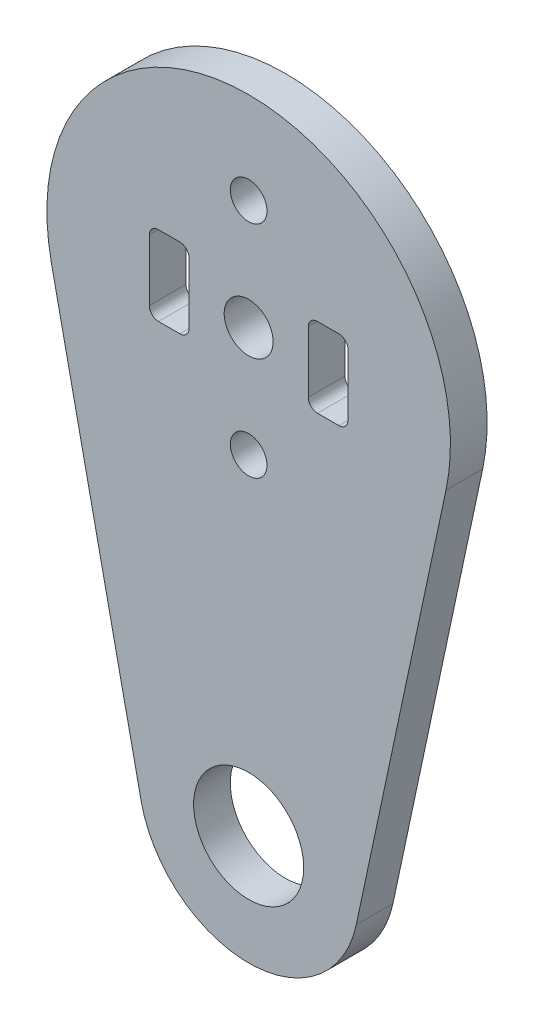
ISO-10303-21;
HEADER;
FILE_DESCRIPTION(('STEP AP214'),'2;1');
FILE_NAME('part.step','',(''),(''),'','','');
FILE_SCHEMA(('AUTOMOTIVE_DESIGN { 1 0 10303 214 1 1 1 1 }'));
ENDSEC;
DATA;
#1=APPLICATION_CONTEXT('core data for automotive mechanical design processes');
#2=APPLICATION_PROTOCOL_DEFINITION('international standard','automotive_design',2000,#1);
#3=PRODUCT_CONTEXT('',#1,'mechanical');
#4=PRODUCT('Part','Part','',(#3));
#5=PRODUCT_RELATED_PRODUCT_CATEGORY('part','',(#4));
#6=PRODUCT_DEFINITION_FORMATION('','',#4);
#7=PRODUCT_DEFINITION_CONTEXT('part definition',#1,'design');
#8=PRODUCT_DEFINITION('design','',#6,#7);
#9=PRODUCT_DEFINITION_SHAPE('','',#8);
#10=(LENGTH_UNIT() NAMED_UNIT(*) SI_UNIT(.MILLI.,.METRE.));
#11=(NAMED_UNIT(*) PLANE_ANGLE_UNIT() SI_UNIT($,.RADIAN.));
#12=(NAMED_UNIT(*) SI_UNIT($,.STERADIAN.) SOLID_ANGLE_UNIT());
#13=UNCERTAINTY_MEASURE_WITH_UNIT(LENGTH_MEASURE(1.E-05),#10,'distance_accuracy_value','');
#14=(GEOMETRIC_REPRESENTATION_CONTEXT(3) GLOBAL_UNCERTAINTY_ASSIGNED_CONTEXT((#13)) GLOBAL_UNIT_ASSIGNED_CONTEXT((#10,
#11,#12)) REPRESENTATION_CONTEXT('',''));
#15=CARTESIAN_POINT('',(0.,0.,0.));
#16=DIRECTION('',(0.,0.,1.));
#17=DIRECTION('',(1.,0.,0.));
#18=AXIS2_PLACEMENT_3D('',#15,#16,#17);
#19=CARTESIAN_POINT('',(215.7478079135,205.9520199932,3.));
#20=DIRECTION('',(0.,0.,1.));
#21=DIRECTION('',(1.,0.,0.));
#22=AXIS2_PLACEMENT_3D('',#19,#20,#21);
#23=PLANE('',#22);
#24=DIRECTION('',(-1.,0.,0.));
#25=VECTOR('',#24,1.);
#26=CARTESIAN_POINT('',(208.3728079135,245.2020199932,3.));
#27=LINE('',#26,#25);
#28=CARTESIAN_POINT('',(210.1228079135,245.2020199932,3.));
#29=VERTEX_POINT('',#28);
#30=CARTESIAN_POINT('',(208.3728079135,245.2020199932,3.));
#31=VERTEX_POINT('',#30);
#32=EDGE_CURVE('E178',#29,#31,#27,.T.);
#33=ORIENTED_EDGE('',*,*,#32,.F.);
#34=CARTESIAN_POINT('',(210.1228079135,244.4520199932,3.));
#35=DIRECTION('',(0.,0.,1.));
#36=DIRECTION('',(1.,0.,0.));
#37=AXIS2_PLACEMENT_3D('',#34,#35,#36);
#38=CIRCLE('',#37,0.750000000000001);
#39=CARTESIAN_POINT('',(210.8728079135,244.4520199932,3.));
#40=VERTEX_POINT('',#39);
#41=EDGE_CURVE('E170',#40,#29,#38,.T.);
#42=ORIENTED_EDGE('',*,*,#41,.F.);
#43=DIRECTION('',(0.,1.,0.));
#44=VECTOR('',#43,1.);
#45=CARTESIAN_POINT('',(210.8728079135,244.4520199932,3.));
#46=LINE('',#45,#44);
#47=CARTESIAN_POINT('',(210.8728079135,239.4520199932,3.));
#48=VERTEX_POINT('',#47);
#49=EDGE_CURVE('E205',#48,#40,#46,.T.);
#50=ORIENTED_EDGE('',*,*,#49,.F.);
#51=CARTESIAN_POINT('',(210.1228079135,239.4520199932,3.));
#52=DIRECTION('',(0.,0.,1.));
#53=DIRECTION('',(1.,0.,0.));
#54=AXIS2_PLACEMENT_3D('',#51,#52,#53);
#55=CIRCLE('',#54,0.750000000000001);
#56=CARTESIAN_POINT('',(210.1228079135,238.7020199932,3.));
#57=VERTEX_POINT('',#56);
#58=EDGE_CURVE('E203',#57,#48,#55,.T.);
#59=ORIENTED_EDGE('',*,*,#58,.F.);
#60=DIRECTION('',(1.,0.,0.));
#61=VECTOR('',#60,1.);
#62=CARTESIAN_POINT('',(210.1228079135,238.7020199932,3.));
#63=LINE('',#62,#61);
#64=CARTESIAN_POINT('',(208.3728079135,238.7020199932,3.));
#65=VERTEX_POINT('',#64);
#66=EDGE_CURVE('E201',#65,#57,#63,.T.);
#67=ORIENTED_EDGE('',*,*,#66,.F.);
#68=CARTESIAN_POINT('',(208.3728079135,239.4520199932,3.));
#69=DIRECTION('',(0.,0.,1.));
#70=DIRECTION('',(1.,0.,0.));
#71=AXIS2_PLACEMENT_3D('',#68,#69,#70);
#72=CIRCLE('',#71,0.750000000000237);
#73=CARTESIAN_POINT('',(207.6228079135,239.4520199932,3.));
#74=VERTEX_POINT('',#73);
#75=EDGE_CURVE('E199',#74,#65,#72,.T.);
#76=ORIENTED_EDGE('',*,*,#75,.F.);
#77=DIRECTION('',(0.,-1.,0.));
#78=VECTOR('',#77,1.);
#79=CARTESIAN_POINT('',(207.6228079135,239.4520199932,3.));
#80=LINE('',#79,#78);
#81=CARTESIAN_POINT('',(207.6228079135,244.4520199932,3.));
#82=VERTEX_POINT('',#81);
#83=EDGE_CURVE('E194',#82,#74,#80,.T.);
#84=ORIENTED_EDGE('',*,*,#83,.F.);
#85=CARTESIAN_POINT('',(208.3728079135,244.4520199932,3.));
#86=DIRECTION('',(0.,0.,1.));
#87=DIRECTION('',(1.,0.,0.));
#88=AXIS2_PLACEMENT_3D('',#85,#86,#87);
#89=CIRCLE('',#88,0.750000000000001);
#90=EDGE_CURVE('E192',#31,#82,#89,.T.);
#91=ORIENTED_EDGE('',*,*,#90,.F.);
#92=EDGE_LOOP('',(#33,#42,#50,#59,#67,#76,#84,#91));
#93=FACE_BOUND('',#92,.T.);
#94=CARTESIAN_POINT('',(215.7478079135,250.9520199932,3.));
#95=DIRECTION('',(0.,0.,1.));
#96=DIRECTION('',(1.,0.,0.));
#97=AXIS2_PLACEMENT_3D('',#94,#95,#96);
#98=CIRCLE('',#97,1.5);
#99=CARTESIAN_POINT('',(217.2478079135,250.9520199932,3.));
#100=VERTEX_POINT('',#99);
#101=EDGE_CURVE('E297',#100,#100,#98,.T.);
#102=ORIENTED_EDGE('',*,*,#101,.F.);
#103=EDGE_LOOP('',(#102));
#104=FACE_BOUND('',#103,.T.);
#105=CARTESIAN_POINT('',(215.7478079135,241.9520199932,3.));
#106=DIRECTION('',(0.,0.,1.));
#107=DIRECTION('',(1.,0.,0.));
#108=AXIS2_PLACEMENT_3D('',#105,#106,#107);
#109=CIRCLE('',#108,2.);
#110=CARTESIAN_POINT('',(217.7478079135,241.9520199932,3.));
#111=VERTEX_POINT('',#110);
#112=EDGE_CURVE('E309',#111,#111,#109,.T.);
#113=ORIENTED_EDGE('',*,*,#112,.F.);
#114=EDGE_LOOP('',(#113));
#115=FACE_BOUND('',#114,.T.);
#116=CARTESIAN_POINT('',(215.7478079135,205.9520199932,3.));
#117=DIRECTION('',(0.,0.,1.));
#118=DIRECTION('',(1.,0.,0.));
#119=AXIS2_PLACEMENT_3D('',#116,#117,#118);
#120=CIRCLE('',#119,8.99999999997151);
#121=CARTESIAN_POINT('',(206.9452869678,204.0770199932,3.));
#122=VERTEX_POINT('',#121);
#123=CARTESIAN_POINT('',(224.5503288592,204.0770199932,3.));
#124=VERTEX_POINT('',#123);
#125=EDGE_CURVE('E315',#122,#124,#120,.T.);
#126=ORIENTED_EDGE('',*,*,#125,.T.);
#127=DIRECTION('',(0.208333333334938,0.97805788285845,0.));
#128=VECTOR('',#127,1.);
#129=CARTESIAN_POINT('',(231.8857629807,238.5145199932,3.));
#130=LINE('',#129,#128);
#131=CARTESIAN_POINT('',(231.8857629807,238.5145199932,3.));
#132=VERTEX_POINT('',#131);
#133=EDGE_CURVE('E318',#124,#132,#130,.T.);
#134=ORIENTED_EDGE('',*,*,#133,.T.);
#135=CARTESIAN_POINT('',(215.7478079135,241.9520199932,3.));
#136=DIRECTION('',(0.,0.,1.));
#137=DIRECTION('',(1.,0.,0.));
#138=AXIS2_PLACEMENT_3D('',#135,#136,#137);
#139=CIRCLE('',#138,16.5000000000293);
#140=CARTESIAN_POINT('',(199.6098528463,238.5145199932,3.));
#141=VERTEX_POINT('',#140);
#142=EDGE_CURVE('E321',#132,#141,#139,.T.);
#143=ORIENTED_EDGE('',*,*,#142,.T.);
#144=DIRECTION('',(0.208333333334939,-0.97805788285845,0.));
#145=VECTOR('',#144,1.);
#146=CARTESIAN_POINT('',(206.9452869678,204.0770199932,3.));
#147=LINE('',#146,#145);
#148=EDGE_CURVE('E323',#141,#122,#147,.T.);
#149=ORIENTED_EDGE('',*,*,#148,.T.);
#150=EDGE_LOOP('',(#126,#134,#143,#149));
#151=FACE_BOUND('',#150,.T.);
#152=CARTESIAN_POINT('',(215.7478079135,232.9520199932,3.));
#153=DIRECTION('',(0.,0.,1.));
#154=DIRECTION('',(1.,0.,0.));
#155=AXIS2_PLACEMENT_3D('',#152,#153,#154);
#156=CIRCLE('',#155,1.5);
#157=CARTESIAN_POINT('',(217.2478079135,232.9520199932,3.));
#158=VERTEX_POINT('',#157);
#159=EDGE_CURVE('E303',#158,#158,#156,.T.);
#160=ORIENTED_EDGE('',*,*,#159,.F.);
#161=EDGE_LOOP('',(#160));
#162=FACE_BOUND('',#161,.T.);
#163=DIRECTION('',(0.,-1.,0.));
#164=VECTOR('',#163,1.);
#165=CARTESIAN_POINT('',(220.6228079135,244.4520199932,3.));
#166=LINE('',#165,#164);
#167=CARTESIAN_POINT('',(220.6228079135,244.4520199932,3.));
#168=VERTEX_POINT('',#167);
#169=CARTESIAN_POINT('',(220.6228079135,239.4520199932,3.));
#170=VERTEX_POINT('',#169);
#171=EDGE_CURVE('E240',#168,#170,#166,.T.);
#172=ORIENTED_EDGE('',*,*,#171,.F.);
#173=CARTESIAN_POINT('',(221.3728079135,244.4520199932,3.));
#174=DIRECTION('',(0.,0.,1.));
#175=DIRECTION('',(1.,0.,0.));
#176=AXIS2_PLACEMENT_3D('',#173,#174,#175);
#177=CIRCLE('',#176,0.750000000000001);
#178=CARTESIAN_POINT('',(221.3728079135,245.2020199932,3.));
#179=VERTEX_POINT('',#178);
#180=EDGE_CURVE('E238',#179,#168,#177,.T.);
#181=ORIENTED_EDGE('',*,*,#180,.F.);
#182=DIRECTION('',(-1.,0.,0.));
#183=VECTOR('',#182,1.);
#184=CARTESIAN_POINT('',(223.1228079135,245.2020199932,3.));
#185=LINE('',#184,#183);
#186=CARTESIAN_POINT('',(223.1228079135,245.2020199932,3.));
#187=VERTEX_POINT('',#186);
#188=EDGE_CURVE('E254',#187,#179,#185,.T.);
#189=ORIENTED_EDGE('',*,*,#188,.F.);
#190=CARTESIAN_POINT('',(223.1228079135,244.4520199932,3.));
#191=DIRECTION('',(0.,0.,1.));
#192=DIRECTION('',(1.,0.,0.));
#193=AXIS2_PLACEMENT_3D('',#190,#191,#192);
#194=CIRCLE('',#193,0.750000000000001);
#195=CARTESIAN_POINT('',(223.8728079135,244.4520199932,3.));
#196=VERTEX_POINT('',#195);
#197=EDGE_CURVE('E251',#196,#187,#194,.T.);
#198=ORIENTED_EDGE('',*,*,#197,.F.);
#199=DIRECTION('',(0.,1.,0.));
#200=VECTOR('',#199,1.);
#201=CARTESIAN_POINT('',(223.8728079135,239.4520199932,3.));
#202=LINE('',#201,#200);
#203=CARTESIAN_POINT('',(223.8728079135,239.4520199932,3.));
#204=VERTEX_POINT('',#203);
#205=EDGE_CURVE('E249',#204,#196,#202,.T.);
#206=ORIENTED_EDGE('',*,*,#205,.F.);
#207=CARTESIAN_POINT('',(223.1228079135,239.4520199932,3.));
#208=DIRECTION('',(0.,0.,1.));
#209=DIRECTION('',(1.,0.,0.));
#210=AXIS2_PLACEMENT_3D('',#207,#208,#209);
#211=CIRCLE('',#210,0.750000000000001);
#212=CARTESIAN_POINT('',(223.1228079135,238.7020199932,3.));
#213=VERTEX_POINT('',#212);
#214=EDGE_CURVE('E247',#213,#204,#211,.T.);
#215=ORIENTED_EDGE('',*,*,#214,.F.);
#216=DIRECTION('',(1.,0.,0.));
#217=VECTOR('',#216,1.);
#218=CARTESIAN_POINT('',(221.3728079135,238.7020199932,3.));
#219=LINE('',#218,#217);
#220=CARTESIAN_POINT('',(221.3728079135,238.7020199932,3.));
#221=VERTEX_POINT('',#220);
#222=EDGE_CURVE('E245',#221,#213,#219,.T.);
#223=ORIENTED_EDGE('',*,*,#222,.F.);
#224=CARTESIAN_POINT('',(221.3728079135,239.4520199932,3.));
#225=DIRECTION('',(0.,0.,1.));
#226=DIRECTION('',(1.,0.,0.));
#227=AXIS2_PLACEMENT_3D('',#224,#225,#226);
#228=CIRCLE('',#227,0.750000000000001);
#229=EDGE_CURVE('E243',#170,#221,#228,.T.);
#230=ORIENTED_EDGE('',*,*,#229,.F.);
#231=EDGE_LOOP('',(#172,#181,#189,#198,#206,#215,#223,#230));
#232=FACE_BOUND('',#231,.T.);
#233=CARTESIAN_POINT('',(215.7478079135,205.9520199932,3.));
#234=DIRECTION('',(0.,0.,1.));
#235=DIRECTION('',(1.,0.,0.));
#236=AXIS2_PLACEMENT_3D('',#233,#234,#235);
#237=CIRCLE('',#236,4.5);
#238=CARTESIAN_POINT('',(220.2478079135,205.9520199932,3.));
#239=VERTEX_POINT('',#238);
#240=EDGE_CURVE('E208',#239,#239,#237,.T.);
#241=ORIENTED_EDGE('',*,*,#240,.F.);
#242=EDGE_LOOP('',(#241));
#243=FACE_BOUND('',#242,.T.);
#244=ADVANCED_FACE('F33',(#93,#104,#115,#151,#162,#232,#243),#23,.T.);
#245=CARTESIAN_POINT('',(215.7478079135,205.9520199932,0.));
#246=DIRECTION('',(0.,0.,1.));
#247=DIRECTION('',(1.,0.,0.));
#248=AXIS2_PLACEMENT_3D('',#245,#246,#247);
#249=PLANE('',#248);
#250=CARTESIAN_POINT('',(210.1228079135,244.4520199932,0.));
#251=DIRECTION('',(0.,0.,1.));
#252=DIRECTION('',(1.,0.,0.));
#253=AXIS2_PLACEMENT_3D('',#250,#251,#252);
#254=CIRCLE('',#253,0.750000000000001);
#255=CARTESIAN_POINT('',(210.8728079135,244.4520199932,0.));
#256=VERTEX_POINT('',#255);
#257=CARTESIAN_POINT('',(210.1228079135,245.2020199932,0.));
#258=VERTEX_POINT('',#257);
#259=EDGE_CURVE('E56',#256,#258,#254,.T.);
#260=ORIENTED_EDGE('',*,*,#259,.T.);
#261=DIRECTION('',(-1.,0.,0.));
#262=VECTOR('',#261,1.);
#263=CARTESIAN_POINT('',(208.3728079135,245.2020199932,0.));
#264=LINE('',#263,#262);
#265=CARTESIAN_POINT('',(208.3728079135,245.2020199932,0.));
#266=VERTEX_POINT('',#265);
#267=EDGE_CURVE('E185',#258,#266,#264,.T.);
#268=ORIENTED_EDGE('',*,*,#267,.T.);
#269=CARTESIAN_POINT('',(208.3728079135,244.4520199932,0.));
#270=DIRECTION('',(0.,0.,1.));
#271=DIRECTION('',(1.,0.,0.));
#272=AXIS2_PLACEMENT_3D('',#269,#270,#271);
#273=CIRCLE('',#272,0.750000000000001);
#274=CARTESIAN_POINT('',(207.6228079135,244.4520199932,0.));
#275=VERTEX_POINT('',#274);
#276=EDGE_CURVE('E210',#266,#275,#273,.T.);
#277=ORIENTED_EDGE('',*,*,#276,.T.);
#278=DIRECTION('',(0.,-1.,0.));
#279=VECTOR('',#278,1.);
#280=CARTESIAN_POINT('',(207.6228079135,239.4520199932,0.));
#281=LINE('',#280,#279);
#282=CARTESIAN_POINT('',(207.6228079135,239.4520199932,0.));
#283=VERTEX_POINT('',#282);
#284=EDGE_CURVE('E213',#275,#283,#281,.T.);
#285=ORIENTED_EDGE('',*,*,#284,.T.);
#286=CARTESIAN_POINT('',(208.3728079135,239.4520199932,0.));
#287=DIRECTION('',(0.,0.,1.));
#288=DIRECTION('',(1.,0.,0.));
#289=AXIS2_PLACEMENT_3D('',#286,#287,#288);
#290=CIRCLE('',#289,0.750000000000237);
#291=CARTESIAN_POINT('',(208.3728079135,238.7020199932,0.));
#292=VERTEX_POINT('',#291);
#293=EDGE_CURVE('E216',#283,#292,#290,.T.);
#294=ORIENTED_EDGE('',*,*,#293,.T.);
#295=DIRECTION('',(1.,0.,0.));
#296=VECTOR('',#295,1.);
#297=CARTESIAN_POINT('',(210.1228079135,238.7020199932,0.));
#298=LINE('',#297,#296);
#299=CARTESIAN_POINT('',(210.1228079135,238.7020199932,0.));
#300=VERTEX_POINT('',#299);
#301=EDGE_CURVE('E219',#292,#300,#298,.T.);
#302=ORIENTED_EDGE('',*,*,#301,.T.);
#303=CARTESIAN_POINT('',(210.1228079135,239.4520199932,0.));
#304=DIRECTION('',(0.,0.,1.));
#305=DIRECTION('',(1.,0.,0.));
#306=AXIS2_PLACEMENT_3D('',#303,#304,#305);
#307=CIRCLE('',#306,0.750000000000001);
#308=CARTESIAN_POINT('',(210.8728079135,239.4520199932,0.));
#309=VERTEX_POINT('',#308);
#310=EDGE_CURVE('E222',#300,#309,#307,.T.);
#311=ORIENTED_EDGE('',*,*,#310,.T.);
#312=DIRECTION('',(0.,1.,0.));
#313=VECTOR('',#312,1.);
#314=CARTESIAN_POINT('',(210.8728079135,244.4520199932,0.));
#315=LINE('',#314,#313);
#316=EDGE_CURVE('E179',#309,#256,#315,.T.);
#317=ORIENTED_EDGE('',*,*,#316,.T.);
#318=EDGE_LOOP('',(#260,#268,#277,#285,#294,#302,#311,#317));
#319=FACE_BOUND('',#318,.T.);
#320=CARTESIAN_POINT('',(215.7478079135,250.9520199932,0.));
#321=DIRECTION('',(0.,0.,1.));
#322=DIRECTION('',(1.,0.,0.));
#323=AXIS2_PLACEMENT_3D('',#320,#321,#322);
#324=CIRCLE('',#323,1.5);
#325=CARTESIAN_POINT('',(217.2478079135,250.9520199932,0.));
#326=VERTEX_POINT('',#325);
#327=EDGE_CURVE('E296',#326,#326,#324,.T.);
#328=ORIENTED_EDGE('',*,*,#327,.T.);
#329=EDGE_LOOP('',(#328));
#330=FACE_BOUND('',#329,.T.);
#331=CARTESIAN_POINT('',(215.7478079135,241.9520199932,0.));
#332=DIRECTION('',(0.,0.,1.));
#333=DIRECTION('',(1.,0.,0.));
#334=AXIS2_PLACEMENT_3D('',#331,#332,#333);
#335=CIRCLE('',#334,2.);
#336=CARTESIAN_POINT('',(217.7478079135,241.9520199932,0.));
#337=VERTEX_POINT('',#336);
#338=EDGE_CURVE('E306',#337,#337,#335,.T.);
#339=ORIENTED_EDGE('',*,*,#338,.T.);
#340=EDGE_LOOP('',(#339));
#341=FACE_BOUND('',#340,.T.);
#342=CARTESIAN_POINT('',(215.7478079135,205.9520199932,0.));
#343=DIRECTION('',(0.,0.,1.));
#344=DIRECTION('',(1.,0.,0.));
#345=AXIS2_PLACEMENT_3D('',#342,#343,#344);
#346=CIRCLE('',#345,8.99999999997151);
#347=CARTESIAN_POINT('',(206.9452869678,204.0770199932,0.));
#348=VERTEX_POINT('',#347);
#349=CARTESIAN_POINT('',(224.5503288592,204.0770199932,0.));
#350=VERTEX_POINT('',#349);
#351=EDGE_CURVE('E312',#348,#350,#346,.T.);
#352=ORIENTED_EDGE('',*,*,#351,.F.);
#353=DIRECTION('',(0.208333333334939,-0.97805788285845,0.));
#354=VECTOR('',#353,1.);
#355=CARTESIAN_POINT('',(206.9452869678,204.0770199932,0.));
#356=LINE('',#355,#354);
#357=CARTESIAN_POINT('',(199.6098528463,238.5145199932,0.));
#358=VERTEX_POINT('',#357);
#359=EDGE_CURVE('E319',#358,#348,#356,.T.);
#360=ORIENTED_EDGE('',*,*,#359,.F.);
#361=CARTESIAN_POINT('',(215.7478079135,241.9520199932,0.));
#362=DIRECTION('',(0.,0.,1.));
#363=DIRECTION('',(1.,0.,0.));
#364=AXIS2_PLACEMENT_3D('',#361,#362,#363);
#365=CIRCLE('',#364,16.5000000000293);
#366=CARTESIAN_POINT('',(231.8857629807,238.5145199932,0.));
#367=VERTEX_POINT('',#366);
#368=EDGE_CURVE('E330',#367,#358,#365,.T.);
#369=ORIENTED_EDGE('',*,*,#368,.F.);
#370=DIRECTION('',(0.208333333334938,0.97805788285845,0.));
#371=VECTOR('',#370,1.);
#372=CARTESIAN_POINT('',(231.8857629807,238.5145199932,0.));
#373=LINE('',#372,#371);
#374=EDGE_CURVE('E328',#350,#367,#373,.T.);
#375=ORIENTED_EDGE('',*,*,#374,.F.);
#376=EDGE_LOOP('',(#352,#360,#369,#375));
#377=FACE_BOUND('',#376,.T.);
#378=CARTESIAN_POINT('',(215.7478079135,232.9520199932,0.));
#379=DIRECTION('',(0.,0.,1.));
#380=DIRECTION('',(1.,0.,0.));
#381=AXIS2_PLACEMENT_3D('',#378,#379,#380);
#382=CIRCLE('',#381,1.5);
#383=CARTESIAN_POINT('',(217.2478079135,232.9520199932,0.));
#384=VERTEX_POINT('',#383);
#385=EDGE_CURVE('E300',#384,#384,#382,.T.);
#386=ORIENTED_EDGE('',*,*,#385,.T.);
#387=EDGE_LOOP('',(#386));
#388=FACE_BOUND('',#387,.T.);
#389=CARTESIAN_POINT('',(221.3728079135,244.4520199932,0.));
#390=DIRECTION('',(0.,0.,1.));
#391=DIRECTION('',(1.,0.,0.));
#392=AXIS2_PLACEMENT_3D('',#389,#390,#391);
#393=CIRCLE('',#392,0.750000000000001);
#394=CARTESIAN_POINT('',(221.3728079135,245.2020199932,0.));
#395=VERTEX_POINT('',#394);
#396=CARTESIAN_POINT('',(220.6228079135,244.4520199932,0.));
#397=VERTEX_POINT('',#396);
#398=EDGE_CURVE('E186',#395,#397,#393,.T.);
#399=ORIENTED_EDGE('',*,*,#398,.T.);
#400=DIRECTION('',(0.,-1.,0.));
#401=VECTOR('',#400,1.);
#402=CARTESIAN_POINT('',(220.6228079135,244.4520199932,0.));
#403=LINE('',#402,#401);
#404=CARTESIAN_POINT('',(220.6228079135,239.4520199932,0.));
#405=VERTEX_POINT('',#404);
#406=EDGE_CURVE('E259',#397,#405,#403,.T.);
#407=ORIENTED_EDGE('',*,*,#406,.T.);
#408=CARTESIAN_POINT('',(221.3728079135,239.4520199932,0.));
#409=DIRECTION('',(0.,0.,1.));
#410=DIRECTION('',(1.,0.,0.));
#411=AXIS2_PLACEMENT_3D('',#408,#409,#410);
#412=CIRCLE('',#411,0.750000000000001);
#413=CARTESIAN_POINT('',(221.3728079135,238.7020199932,0.));
#414=VERTEX_POINT('',#413);
#415=EDGE_CURVE('E262',#405,#414,#412,.T.);
#416=ORIENTED_EDGE('',*,*,#415,.T.);
#417=DIRECTION('',(1.,0.,0.));
#418=VECTOR('',#417,1.);
#419=CARTESIAN_POINT('',(221.3728079135,238.7020199932,0.));
#420=LINE('',#419,#418);
#421=CARTESIAN_POINT('',(223.1228079135,238.7020199932,0.));
#422=VERTEX_POINT('',#421);
#423=EDGE_CURVE('E265',#414,#422,#420,.T.);
#424=ORIENTED_EDGE('',*,*,#423,.T.);
#425=CARTESIAN_POINT('',(223.1228079135,239.4520199932,0.));
#426=DIRECTION('',(0.,0.,1.));
#427=DIRECTION('',(1.,0.,0.));
#428=AXIS2_PLACEMENT_3D('',#425,#426,#427);
#429=CIRCLE('',#428,0.750000000000001);
#430=CARTESIAN_POINT('',(223.8728079135,239.4520199932,0.));
#431=VERTEX_POINT('',#430);
#432=EDGE_CURVE('E268',#422,#431,#429,.T.);
#433=ORIENTED_EDGE('',*,*,#432,.T.);
#434=DIRECTION('',(0.,1.,0.));
#435=VECTOR('',#434,1.);
#436=CARTESIAN_POINT('',(223.8728079135,239.4520199932,0.));
#437=LINE('',#436,#435);
#438=CARTESIAN_POINT('',(223.8728079135,244.4520199932,0.));
#439=VERTEX_POINT('',#438);
#440=EDGE_CURVE('E271',#431,#439,#437,.T.);
#441=ORIENTED_EDGE('',*,*,#440,.T.);
#442=CARTESIAN_POINT('',(223.1228079135,244.4520199932,0.));
#443=DIRECTION('',(0.,0.,1.));
#444=DIRECTION('',(1.,0.,0.));
#445=AXIS2_PLACEMENT_3D('',#442,#443,#444);
#446=CIRCLE('',#445,0.750000000000001);
#447=CARTESIAN_POINT('',(223.1228079135,245.2020199932,0.));
#448=VERTEX_POINT('',#447);
#449=EDGE_CURVE('E274',#439,#448,#446,.T.);
#450=ORIENTED_EDGE('',*,*,#449,.T.);
#451=DIRECTION('',(-1.,0.,0.));
#452=VECTOR('',#451,1.);
#453=CARTESIAN_POINT('',(223.1228079135,245.2020199932,0.));
#454=LINE('',#453,#452);
#455=EDGE_CURVE('E241',#448,#395,#454,.T.);
#456=ORIENTED_EDGE('',*,*,#455,.T.);
#457=EDGE_LOOP('',(#399,#407,#416,#424,#433,#441,#450,#456));
#458=FACE_BOUND('',#457,.T.);
#459=CARTESIAN_POINT('',(215.7478079135,205.9520199932,0.));
#460=DIRECTION('',(0.,0.,1.));
#461=DIRECTION('',(1.,0.,0.));
#462=AXIS2_PLACEMENT_3D('',#459,#460,#461);
#463=CIRCLE('',#462,4.5);
#464=CARTESIAN_POINT('',(220.2478079135,205.9520199932,0.));
#465=VERTEX_POINT('',#464);
#466=EDGE_CURVE('E469',#465,#465,#463,.T.);
#467=ORIENTED_EDGE('',*,*,#466,.T.);
#468=EDGE_LOOP('',(#467));
#469=FACE_BOUND('',#468,.T.);
#470=ADVANCED_FACE('F348',(#319,#330,#341,#377,#388,#458,#469),#249,.F.);
#471=CARTESIAN_POINT('',(215.7478079135,205.9520199932,3.));
#472=DIRECTION('',(0.,0.,-1.));
#473=DIRECTION('',(-1.,0.,0.));
#474=AXIS2_PLACEMENT_3D('',#471,#472,#473);
#475=CYLINDRICAL_SURFACE('',#474,8.99999999997151);
#476=ORIENTED_EDGE('',*,*,#351,.T.);
#477=DIRECTION('',(0.,0.,-1.));
#478=VECTOR('',#477,1.);
#479=CARTESIAN_POINT('',(224.5503288592,204.0770199932,3.));
#480=LINE('',#479,#478);
#481=EDGE_CURVE('E11',#124,#350,#480,.T.);
#482=ORIENTED_EDGE('',*,*,#481,.F.);
#483=ORIENTED_EDGE('',*,*,#125,.F.);
#484=DIRECTION('',(0.,0.,-1.));
#485=VECTOR('',#484,1.);
#486=CARTESIAN_POINT('',(206.9452869678,204.0770199932,3.));
#487=LINE('',#486,#485);
#488=EDGE_CURVE('E325',#122,#348,#487,.T.);
#489=ORIENTED_EDGE('',*,*,#488,.T.);
#490=EDGE_LOOP('',(#476,#482,#483,#489));
#491=FACE_BOUND('',#490,.T.);
#492=ADVANCED_FACE('F35',(#491),#475,.T.);
#493=CARTESIAN_POINT('',(231.8857629807,238.5145199932,3.));
#494=DIRECTION('',(-0.97805788285845,0.208333333334938,0.));
#495=DIRECTION('',(-0.208333333334938,-0.97805788285845,0.));
#496=AXIS2_PLACEMENT_3D('',#493,#494,#495);
#497=PLANE('',#496);
#498=ORIENTED_EDGE('',*,*,#374,.T.);
#499=DIRECTION('',(0.,0.,-1.));
#500=VECTOR('',#499,1.);
#501=CARTESIAN_POINT('',(231.8857629807,238.5145199932,3.));
#502=LINE('',#501,#500);
#503=EDGE_CURVE('E41',#132,#367,#502,.T.);
#504=ORIENTED_EDGE('',*,*,#503,.F.);
#505=ORIENTED_EDGE('',*,*,#133,.F.);
#506=ORIENTED_EDGE('',*,*,#481,.T.);
#507=EDGE_LOOP('',(#498,#504,#505,#506));
#508=FACE_BOUND('',#507,.T.);
#509=ADVANCED_FACE('F359',(#508),#497,.F.);
#510=CARTESIAN_POINT('',(215.7478079135,241.9520199932,3.));
#511=DIRECTION('',(0.,0.,-1.));
#512=DIRECTION('',(-1.,0.,0.));
#513=AXIS2_PLACEMENT_3D('',#510,#511,#512);
#514=CYLINDRICAL_SURFACE('',#513,16.5000000000293);
#515=ORIENTED_EDGE('',*,*,#368,.T.);
#516=DIRECTION('',(0.,0.,-1.));
#517=VECTOR('',#516,1.);
#518=CARTESIAN_POINT('',(199.6098528463,238.5145199932,3.));
#519=LINE('',#518,#517);
#520=EDGE_CURVE('E335',#141,#358,#519,.T.);
#521=ORIENTED_EDGE('',*,*,#520,.F.);
#522=ORIENTED_EDGE('',*,*,#142,.F.);
#523=ORIENTED_EDGE('',*,*,#503,.T.);
#524=EDGE_LOOP('',(#515,#521,#522,#523));
#525=FACE_BOUND('',#524,.T.);
#526=ADVANCED_FACE('F342',(#525),#514,.T.);
#527=CARTESIAN_POINT('',(206.9452869678,204.0770199932,3.));
#528=DIRECTION('',(0.97805788285845,0.208333333334939,0.));
#529=DIRECTION('',(-0.208333333334939,0.97805788285845,0.));
#530=AXIS2_PLACEMENT_3D('',#527,#528,#529);
#531=PLANE('',#530);
#532=ORIENTED_EDGE('',*,*,#359,.T.);
#533=ORIENTED_EDGE('',*,*,#488,.F.);
#534=ORIENTED_EDGE('',*,*,#148,.F.);
#535=ORIENTED_EDGE('',*,*,#520,.T.);
#536=EDGE_LOOP('',(#532,#533,#534,#535));
#537=FACE_BOUND('',#536,.T.);
#538=ADVANCED_FACE('F352',(#537),#531,.F.);
#539=CARTESIAN_POINT('',(215.7478079135,241.9520199932,3.));
#540=DIRECTION('',(0.,0.,-1.));
#541=DIRECTION('',(-1.,0.,0.));
#542=AXIS2_PLACEMENT_3D('',#539,#540,#541);
#543=CYLINDRICAL_SURFACE('',#542,2.);
#544=ORIENTED_EDGE('',*,*,#112,.T.);
#545=EDGE_LOOP('',(#544));
#546=FACE_BOUND('',#545,.T.);
#547=ORIENTED_EDGE('',*,*,#338,.F.);
#548=EDGE_LOOP('',(#547));
#549=FACE_BOUND('',#548,.T.);
#550=ADVANCED_FACE('F374',(#546,#549),#543,.F.);
#551=CARTESIAN_POINT('',(215.7478079135,232.9520199932,3.));
#552=DIRECTION('',(0.,0.,-1.));
#553=DIRECTION('',(-1.,0.,0.));
#554=AXIS2_PLACEMENT_3D('',#551,#552,#553);
#555=CYLINDRICAL_SURFACE('',#554,1.5);
#556=ORIENTED_EDGE('',*,*,#159,.T.);
#557=EDGE_LOOP('',(#556));
#558=FACE_BOUND('',#557,.T.);
#559=ORIENTED_EDGE('',*,*,#385,.F.);
#560=EDGE_LOOP('',(#559));
#561=FACE_BOUND('',#560,.T.);
#562=ADVANCED_FACE('F381',(#558,#561),#555,.F.);
#563=CARTESIAN_POINT('',(215.7478079135,250.9520199932,3.));
#564=DIRECTION('',(0.,0.,-1.));
#565=DIRECTION('',(-1.,0.,0.));
#566=AXIS2_PLACEMENT_3D('',#563,#564,#565);
#567=CYLINDRICAL_SURFACE('',#566,1.5);
#568=ORIENTED_EDGE('',*,*,#101,.T.);
#569=EDGE_LOOP('',(#568));
#570=FACE_BOUND('',#569,.T.);
#571=ORIENTED_EDGE('',*,*,#327,.F.);
#572=EDGE_LOOP('',(#571));
#573=FACE_BOUND('',#572,.T.);
#574=ADVANCED_FACE('F386',(#570,#573),#567,.F.);
#575=CARTESIAN_POINT('',(221.3728079135,244.4520199932,3.));
#576=DIRECTION('',(0.,0.,-1.));
#577=DIRECTION('',(-1.,0.,0.));
#578=AXIS2_PLACEMENT_3D('',#575,#576,#577);
#579=CYLINDRICAL_SURFACE('',#578,0.750000000000001);
#580=ORIENTED_EDGE('',*,*,#398,.F.);
#581=DIRECTION('',(0.,0.,-1.));
#582=VECTOR('',#581,1.);
#583=CARTESIAN_POINT('',(221.3728079135,245.2020199932,3.));
#584=LINE('',#583,#582);
#585=EDGE_CURVE('E256',#179,#395,#584,.T.);
#586=ORIENTED_EDGE('',*,*,#585,.F.);
#587=ORIENTED_EDGE('',*,*,#180,.T.);
#588=DIRECTION('',(0.,0.,-1.));
#589=VECTOR('',#588,1.);
#590=CARTESIAN_POINT('',(220.6228079135,244.4520199932,3.));
#591=LINE('',#590,#589);
#592=EDGE_CURVE('E293',#168,#397,#591,.T.);
#593=ORIENTED_EDGE('',*,*,#592,.T.);
#594=EDGE_LOOP('',(#580,#586,#587,#593));
#595=FACE_BOUND('',#594,.T.);
#596=ADVANCED_FACE('F396',(#595),#579,.F.);
#597=CARTESIAN_POINT('',(220.6228079135,244.4520199932,3.));
#598=DIRECTION('',(1.,0.,0.));
#599=DIRECTION('',(0.,0.,-1.));
#600=AXIS2_PLACEMENT_3D('',#597,#598,#599);
#601=PLANE('',#600);
#602=ORIENTED_EDGE('',*,*,#406,.F.);
#603=ORIENTED_EDGE('',*,*,#592,.F.);
#604=ORIENTED_EDGE('',*,*,#171,.T.);
#605=DIRECTION('',(0.,0.,-1.));
#606=VECTOR('',#605,1.);
#607=CARTESIAN_POINT('',(220.6228079135,239.4520199932,3.));
#608=LINE('',#607,#606);
#609=EDGE_CURVE('E291',#170,#405,#608,.T.);
#610=ORIENTED_EDGE('',*,*,#609,.T.);
#611=EDGE_LOOP('',(#602,#603,#604,#610));
#612=FACE_BOUND('',#611,.T.);
#613=ADVANCED_FACE('F403',(#612),#601,.T.);
#614=CARTESIAN_POINT('',(221.3728079135,239.4520199932,3.));
#615=DIRECTION('',(0.,0.,-1.));
#616=DIRECTION('',(-1.,0.,0.));
#617=AXIS2_PLACEMENT_3D('',#614,#615,#616);
#618=CYLINDRICAL_SURFACE('',#617,0.750000000000001);
#619=ORIENTED_EDGE('',*,*,#415,.F.);
#620=ORIENTED_EDGE('',*,*,#609,.F.);
#621=ORIENTED_EDGE('',*,*,#229,.T.);
#622=DIRECTION('',(0.,0.,-1.));
#623=VECTOR('',#622,1.);
#624=CARTESIAN_POINT('',(221.3728079135,238.7020199932,3.));
#625=LINE('',#624,#623);
#626=EDGE_CURVE('E289',#221,#414,#625,.T.);
#627=ORIENTED_EDGE('',*,*,#626,.T.);
#628=EDGE_LOOP('',(#619,#620,#621,#627));
#629=FACE_BOUND('',#628,.T.);
#630=ADVANCED_FACE('F407',(#629),#618,.F.);
#631=CARTESIAN_POINT('',(221.3728079135,238.7020199932,3.));
#632=DIRECTION('',(0.,1.,0.));
#633=DIRECTION('',(0.,0.,1.));
#634=AXIS2_PLACEMENT_3D('',#631,#632,#633);
#635=PLANE('',#634);
#636=ORIENTED_EDGE('',*,*,#423,.F.);
#637=ORIENTED_EDGE('',*,*,#626,.F.);
#638=ORIENTED_EDGE('',*,*,#222,.T.);
#639=DIRECTION('',(0.,0.,-1.));
#640=VECTOR('',#639,1.);
#641=CARTESIAN_POINT('',(223.1228079135,238.7020199932,3.));
#642=LINE('',#641,#640);
#643=EDGE_CURVE('E287',#213,#422,#642,.T.);
#644=ORIENTED_EDGE('',*,*,#643,.T.);
#645=EDGE_LOOP('',(#636,#637,#638,#644));
#646=FACE_BOUND('',#645,.T.);
#647=ADVANCED_FACE('F411',(#646),#635,.T.);
#648=CARTESIAN_POINT('',(223.1228079135,239.4520199932,3.));
#649=DIRECTION('',(0.,0.,-1.));
#650=DIRECTION('',(-1.,0.,0.));
#651=AXIS2_PLACEMENT_3D('',#648,#649,#650);
#652=CYLINDRICAL_SURFACE('',#651,0.750000000000001);
#653=ORIENTED_EDGE('',*,*,#432,.F.);
#654=ORIENTED_EDGE('',*,*,#643,.F.);
#655=ORIENTED_EDGE('',*,*,#214,.T.);
#656=DIRECTION('',(0.,0.,-1.));
#657=VECTOR('',#656,1.);
#658=CARTESIAN_POINT('',(223.8728079135,239.4520199932,3.));
#659=LINE('',#658,#657);
#660=EDGE_CURVE('E285',#204,#431,#659,.T.);
#661=ORIENTED_EDGE('',*,*,#660,.T.);
#662=EDGE_LOOP('',(#653,#654,#655,#661));
#663=FACE_BOUND('',#662,.T.);
#664=ADVANCED_FACE('F415',(#663),#652,.F.);
#665=CARTESIAN_POINT('',(223.8728079135,239.4520199932,3.));
#666=DIRECTION('',(-1.,0.,0.));
#667=DIRECTION('',(0.,0.,1.));
#668=AXIS2_PLACEMENT_3D('',#665,#666,#667);
#669=PLANE('',#668);
#670=ORIENTED_EDGE('',*,*,#440,.F.);
#671=ORIENTED_EDGE('',*,*,#660,.F.);
#672=ORIENTED_EDGE('',*,*,#205,.T.);
#673=DIRECTION('',(0.,0.,-1.));
#674=VECTOR('',#673,1.);
#675=CARTESIAN_POINT('',(223.8728079135,244.4520199932,3.));
#676=LINE('',#675,#674);
#677=EDGE_CURVE('E283',#196,#439,#676,.T.);
#678=ORIENTED_EDGE('',*,*,#677,.T.);
#679=EDGE_LOOP('',(#670,#671,#672,#678));
#680=FACE_BOUND('',#679,.T.);
#681=ADVANCED_FACE('F419',(#680),#669,.T.);
#682=CARTESIAN_POINT('',(223.1228079135,244.4520199932,3.));
#683=DIRECTION('',(0.,0.,-1.));
#684=DIRECTION('',(-1.,0.,0.));
#685=AXIS2_PLACEMENT_3D('',#682,#683,#684);
#686=CYLINDRICAL_SURFACE('',#685,0.750000000000001);
#687=ORIENTED_EDGE('',*,*,#449,.F.);
#688=ORIENTED_EDGE('',*,*,#677,.F.);
#689=ORIENTED_EDGE('',*,*,#197,.T.);
#690=DIRECTION('',(0.,0.,-1.));
#691=VECTOR('',#690,1.);
#692=CARTESIAN_POINT('',(223.1228079135,245.2020199932,3.));
#693=LINE('',#692,#691);
#694=EDGE_CURVE('E281',#187,#448,#693,.T.);
#695=ORIENTED_EDGE('',*,*,#694,.T.);
#696=EDGE_LOOP('',(#687,#688,#689,#695));
#697=FACE_BOUND('',#696,.T.);
#698=ADVANCED_FACE('F423',(#697),#686,.F.);
#699=CARTESIAN_POINT('',(223.1228079135,245.2020199932,3.));
#700=DIRECTION('',(0.,-1.,0.));
#701=DIRECTION('',(0.,0.,-1.));
#702=AXIS2_PLACEMENT_3D('',#699,#700,#701);
#703=PLANE('',#702);
#704=ORIENTED_EDGE('',*,*,#455,.F.);
#705=ORIENTED_EDGE('',*,*,#694,.F.);
#706=ORIENTED_EDGE('',*,*,#188,.T.);
#707=ORIENTED_EDGE('',*,*,#585,.T.);
#708=EDGE_LOOP('',(#704,#705,#706,#707));
#709=FACE_BOUND('',#708,.T.);
#710=ADVANCED_FACE('F427',(#709),#703,.T.);
#711=CARTESIAN_POINT('',(210.1228079135,244.4520199932,3.));
#712=DIRECTION('',(0.,0.,-1.));
#713=DIRECTION('',(-1.,0.,0.));
#714=AXIS2_PLACEMENT_3D('',#711,#712,#713);
#715=CYLINDRICAL_SURFACE('',#714,0.750000000000001);
#716=ORIENTED_EDGE('',*,*,#259,.F.);
#717=DIRECTION('',(0.,0.,-1.));
#718=VECTOR('',#717,1.);
#719=CARTESIAN_POINT('',(210.8728079135,244.4520199932,3.));
#720=LINE('',#719,#718);
#721=EDGE_CURVE('E174',#40,#256,#720,.T.);
#722=ORIENTED_EDGE('',*,*,#721,.F.);
#723=ORIENTED_EDGE('',*,*,#41,.T.);
#724=DIRECTION('',(0.,0.,-1.));
#725=VECTOR('',#724,1.);
#726=CARTESIAN_POINT('',(210.1228079135,245.2020199932,3.));
#727=LINE('',#726,#725);
#728=EDGE_CURVE('E173',#29,#258,#727,.T.);
#729=ORIENTED_EDGE('',*,*,#728,.T.);
#730=EDGE_LOOP('',(#716,#722,#723,#729));
#731=FACE_BOUND('',#730,.T.);
#732=ADVANCED_FACE('F172',(#731),#715,.F.);
#733=CARTESIAN_POINT('',(208.3728079135,245.2020199932,3.));
#734=DIRECTION('',(0.,-1.,0.));
#735=DIRECTION('',(0.,0.,-1.));
#736=AXIS2_PLACEMENT_3D('',#733,#734,#735);
#737=PLANE('',#736);
#738=ORIENTED_EDGE('',*,*,#267,.F.);
#739=ORIENTED_EDGE('',*,*,#728,.F.);
#740=ORIENTED_EDGE('',*,*,#32,.T.);
#741=DIRECTION('',(0.,0.,-1.));
#742=VECTOR('',#741,1.);
#743=CARTESIAN_POINT('',(208.3728079135,245.2020199932,3.));
#744=LINE('',#743,#742);
#745=EDGE_CURVE('E187',#31,#266,#744,.T.);
#746=ORIENTED_EDGE('',*,*,#745,.T.);
#747=EDGE_LOOP('',(#738,#739,#740,#746));
#748=FACE_BOUND('',#747,.T.);
#749=ADVANCED_FACE('F182',(#748),#737,.T.);
#750=CARTESIAN_POINT('',(208.3728079135,244.4520199932,3.));
#751=DIRECTION('',(0.,0.,-1.));
#752=DIRECTION('',(-1.,0.,0.));
#753=AXIS2_PLACEMENT_3D('',#750,#751,#752);
#754=CYLINDRICAL_SURFACE('',#753,0.750000000000001);
#755=ORIENTED_EDGE('',*,*,#276,.F.);
#756=ORIENTED_EDGE('',*,*,#745,.F.);
#757=ORIENTED_EDGE('',*,*,#90,.T.);
#758=DIRECTION('',(0.,0.,-1.));
#759=VECTOR('',#758,1.);
#760=CARTESIAN_POINT('',(207.6228079135,244.4520199932,3.));
#761=LINE('',#760,#759);
#762=EDGE_CURVE('E235',#82,#275,#761,.T.);
#763=ORIENTED_EDGE('',*,*,#762,.T.);
#764=EDGE_LOOP('',(#755,#756,#757,#763));
#765=FACE_BOUND('',#764,.T.);
#766=ADVANCED_FACE('F436',(#765),#754,.F.);
#767=CARTESIAN_POINT('',(207.6228079135,239.4520199932,3.));
#768=DIRECTION('',(1.,0.,0.));
#769=DIRECTION('',(0.,0.,-1.));
#770=AXIS2_PLACEMENT_3D('',#767,#768,#769);
#771=PLANE('',#770);
#772=ORIENTED_EDGE('',*,*,#284,.F.);
#773=ORIENTED_EDGE('',*,*,#762,.F.);
#774=ORIENTED_EDGE('',*,*,#83,.T.);
#775=DIRECTION('',(0.,0.,-1.));
#776=VECTOR('',#775,1.);
#777=CARTESIAN_POINT('',(207.6228079135,239.4520199932,3.));
#778=LINE('',#777,#776);
#779=EDGE_CURVE('E233',#74,#283,#778,.T.);
#780=ORIENTED_EDGE('',*,*,#779,.T.);
#781=EDGE_LOOP('',(#772,#773,#774,#780));
#782=FACE_BOUND('',#781,.T.);
#783=ADVANCED_FACE('F439',(#782),#771,.T.);
#784=CARTESIAN_POINT('',(208.3728079135,239.4520199932,3.));
#785=DIRECTION('',(0.,0.,-1.));
#786=DIRECTION('',(-1.,0.,0.));
#787=AXIS2_PLACEMENT_3D('',#784,#785,#786);
#788=CYLINDRICAL_SURFACE('',#787,0.750000000000237);
#789=ORIENTED_EDGE('',*,*,#293,.F.);
#790=ORIENTED_EDGE('',*,*,#779,.F.);
#791=ORIENTED_EDGE('',*,*,#75,.T.);
#792=DIRECTION('',(0.,0.,-1.));
#793=VECTOR('',#792,1.);
#794=CARTESIAN_POINT('',(208.3728079135,238.7020199932,3.));
#795=LINE('',#794,#793);
#796=EDGE_CURVE('E231',#65,#292,#795,.T.);
#797=ORIENTED_EDGE('',*,*,#796,.T.);
#798=EDGE_LOOP('',(#789,#790,#791,#797));
#799=FACE_BOUND('',#798,.T.);
#800=ADVANCED_FACE('F443',(#799),#788,.F.);
#801=CARTESIAN_POINT('',(210.1228079135,238.7020199932,3.));
#802=DIRECTION('',(0.,1.,0.));
#803=DIRECTION('',(0.,0.,1.));
#804=AXIS2_PLACEMENT_3D('',#801,#802,#803);
#805=PLANE('',#804);
#806=ORIENTED_EDGE('',*,*,#301,.F.);
#807=ORIENTED_EDGE('',*,*,#796,.F.);
#808=ORIENTED_EDGE('',*,*,#66,.T.);
#809=DIRECTION('',(0.,0.,-1.));
#810=VECTOR('',#809,1.);
#811=CARTESIAN_POINT('',(210.1228079135,238.7020199932,3.));
#812=LINE('',#811,#810);
#813=EDGE_CURVE('E229',#57,#300,#812,.T.);
#814=ORIENTED_EDGE('',*,*,#813,.T.);
#815=EDGE_LOOP('',(#806,#807,#808,#814));
#816=FACE_BOUND('',#815,.T.);
#817=ADVANCED_FACE('F447',(#816),#805,.T.);
#818=CARTESIAN_POINT('',(210.1228079135,239.4520199932,3.));
#819=DIRECTION('',(0.,0.,-1.));
#820=DIRECTION('',(-1.,0.,0.));
#821=AXIS2_PLACEMENT_3D('',#818,#819,#820);
#822=CYLINDRICAL_SURFACE('',#821,0.750000000000001);
#823=ORIENTED_EDGE('',*,*,#310,.F.);
#824=ORIENTED_EDGE('',*,*,#813,.F.);
#825=ORIENTED_EDGE('',*,*,#58,.T.);
#826=DIRECTION('',(0.,0.,-1.));
#827=VECTOR('',#826,1.);
#828=CARTESIAN_POINT('',(210.8728079135,239.4520199932,3.));
#829=LINE('',#828,#827);
#830=EDGE_CURVE('E48',#48,#309,#829,.T.);
#831=ORIENTED_EDGE('',*,*,#830,.T.);
#832=EDGE_LOOP('',(#823,#824,#825,#831));
#833=FACE_BOUND('',#832,.T.);
#834=ADVANCED_FACE('F451',(#833),#822,.F.);
#835=CARTESIAN_POINT('',(210.8728079135,244.4520199932,3.));
#836=DIRECTION('',(-1.,0.,0.));
#837=DIRECTION('',(0.,0.,1.));
#838=AXIS2_PLACEMENT_3D('',#835,#836,#837);
#839=PLANE('',#838);
#840=ORIENTED_EDGE('',*,*,#316,.F.);
#841=ORIENTED_EDGE('',*,*,#830,.F.);
#842=ORIENTED_EDGE('',*,*,#49,.T.);
#843=ORIENTED_EDGE('',*,*,#721,.T.);
#844=EDGE_LOOP('',(#840,#841,#842,#843));
#845=FACE_BOUND('',#844,.T.);
#846=ADVANCED_FACE('F455',(#845),#839,.T.);
#847=CARTESIAN_POINT('',(215.7478079135,205.9520199932,3.));
#848=DIRECTION('',(0.,0.,-1.));
#849=DIRECTION('',(-1.,0.,0.));
#850=AXIS2_PLACEMENT_3D('',#847,#848,#849);
#851=CYLINDRICAL_SURFACE('',#850,4.5);
#852=ORIENTED_EDGE('',*,*,#240,.T.);
#853=EDGE_LOOP('',(#852));
#854=FACE_BOUND('',#853,.T.);
#855=ORIENTED_EDGE('',*,*,#466,.F.);
#856=EDGE_LOOP('',(#855));
#857=FACE_BOUND('',#856,.T.);
#858=ADVANCED_FACE('F459',(#854,#857),#851,.F.);
#859=CLOSED_SHELL('',(#244,#470,#492,#509,#526,#538,#550,#562,#574,#596,#613,#630,#647,#664,
#681,#698,#710,#732,#749,#766,#783,#800,#817,#834,#846,#858));
#860=MANIFOLD_SOLID_BREP('B2',#859);
#861=ADVANCED_BREP_SHAPE_REPRESENTATION('',(#18,#860),#14);
#862=SHAPE_DEFINITION_REPRESENTATION(#9,#861);
ENDSEC;
END-ISO-10303-21;
